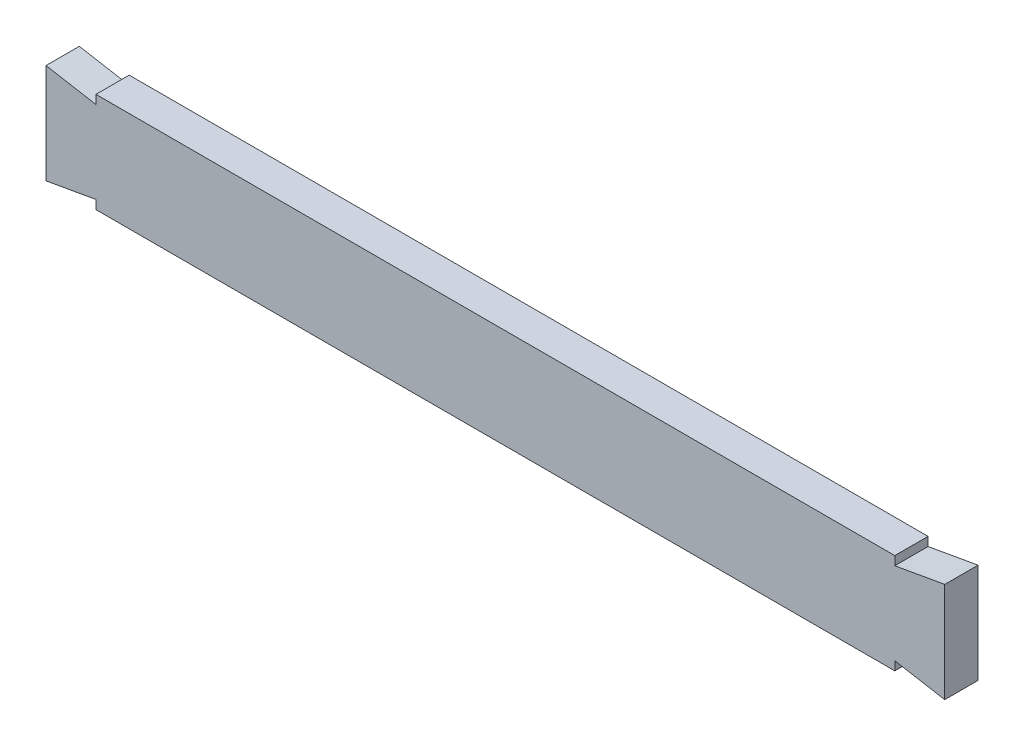
ISO-10303-21;
HEADER;
FILE_DESCRIPTION(('STEP AP214'),'2;1');
FILE_NAME('part.step','',(''),(''),'','','');
FILE_SCHEMA(('AUTOMOTIVE_DESIGN { 1 0 10303 214 1 1 1 1 }'));
ENDSEC;
DATA;
#1=APPLICATION_CONTEXT('core data for automotive mechanical design processes');
#2=APPLICATION_PROTOCOL_DEFINITION('international standard','automotive_design',2000,#1);
#3=PRODUCT_CONTEXT('',#1,'mechanical');
#4=PRODUCT('Part','Part','',(#3));
#5=PRODUCT_RELATED_PRODUCT_CATEGORY('part','',(#4));
#6=PRODUCT_DEFINITION_FORMATION('','',#4);
#7=PRODUCT_DEFINITION_CONTEXT('part definition',#1,'design');
#8=PRODUCT_DEFINITION('design','',#6,#7);
#9=PRODUCT_DEFINITION_SHAPE('','',#8);
#10=(LENGTH_UNIT() NAMED_UNIT(*) SI_UNIT(.MILLI.,.METRE.));
#11=(NAMED_UNIT(*) PLANE_ANGLE_UNIT() SI_UNIT($,.RADIAN.));
#12=(NAMED_UNIT(*) SI_UNIT($,.STERADIAN.) SOLID_ANGLE_UNIT());
#13=UNCERTAINTY_MEASURE_WITH_UNIT(LENGTH_MEASURE(1.E-05),#10,'distance_accuracy_value','');
#14=(GEOMETRIC_REPRESENTATION_CONTEXT(3) GLOBAL_UNCERTAINTY_ASSIGNED_CONTEXT((#13)) GLOBAL_UNIT_ASSIGNED_CONTEXT((#10,
#11,#12)) REPRESENTATION_CONTEXT('',''));
#15=CARTESIAN_POINT('',(0.,0.,0.));
#16=DIRECTION('',(0.,0.,1.));
#17=DIRECTION('',(1.,0.,0.));
#18=AXIS2_PLACEMENT_3D('',#15,#16,#17);
#19=CARTESIAN_POINT('',(0.,0.,10.));
#20=DIRECTION('',(1.,0.,0.));
#21=DIRECTION('',(0.,0.,-1.));
#22=AXIS2_PLACEMENT_3D('',#19,#20,#21);
#23=PLANE('',#22);
#24=DIRECTION('',(0.,-1.,0.));
#25=VECTOR('',#24,1.);
#26=CARTESIAN_POINT('',(0.,0.,0.));
#27=LINE('',#26,#25);
#28=CARTESIAN_POINT('',(0.,30.,0.));
#29=VERTEX_POINT('',#28);
#30=CARTESIAN_POINT('',(0.,0.,0.));
#31=VERTEX_POINT('',#30);
#32=EDGE_CURVE('E134',#29,#31,#27,.T.);
#33=ORIENTED_EDGE('',*,*,#32,.T.);
#34=DIRECTION('',(0.,0.,-1.));
#35=VECTOR('',#34,1.);
#36=CARTESIAN_POINT('',(0.,0.,10.));
#37=LINE('',#36,#35);
#38=CARTESIAN_POINT('',(0.,0.,10.));
#39=VERTEX_POINT('',#38);
#40=EDGE_CURVE('E11',#39,#31,#37,.T.);
#41=ORIENTED_EDGE('',*,*,#40,.F.);
#42=DIRECTION('',(0.,-1.,0.));
#43=VECTOR('',#42,1.);
#44=CARTESIAN_POINT('',(0.,0.,10.));
#45=LINE('',#44,#43);
#46=CARTESIAN_POINT('',(0.,30.,10.));
#47=VERTEX_POINT('',#46);
#48=EDGE_CURVE('E159',#47,#39,#45,.T.);
#49=ORIENTED_EDGE('',*,*,#48,.F.);
#50=DIRECTION('',(0.,0.,-1.));
#51=VECTOR('',#50,1.);
#52=CARTESIAN_POINT('',(0.,30.,10.));
#53=LINE('',#52,#51);
#54=EDGE_CURVE('E140',#47,#29,#53,.T.);
#55=ORIENTED_EDGE('',*,*,#54,.T.);
#56=EDGE_LOOP('',(#33,#41,#49,#55));
#57=FACE_BOUND('',#56,.T.);
#58=ADVANCED_FACE('F32',(#57),#23,.F.);
#59=CARTESIAN_POINT('',(0.,0.,10.));
#60=DIRECTION('',(0.,1.,0.));
#61=DIRECTION('',(0.,0.,1.));
#62=AXIS2_PLACEMENT_3D('',#59,#60,#61);
#63=PLANE('',#62);
#64=DIRECTION('',(1.,0.,0.));
#65=VECTOR('',#64,1.);
#66=CARTESIAN_POINT('',(0.,0.,0.));
#67=LINE('',#66,#65);
#68=CARTESIAN_POINT('',(15.,0.,0.));
#69=VERTEX_POINT('',#68);
#70=CARTESIAN_POINT('',(255.,0.,0.));
#71=VERTEX_POINT('',#70);
#72=EDGE_CURVE('E141',#69,#71,#67,.T.);
#73=ORIENTED_EDGE('',*,*,#72,.T.);
#74=DIRECTION('',(0.,0.,1.));
#75=VECTOR('',#74,1.);
#76=CARTESIAN_POINT('',(255.,0.,0.));
#77=LINE('',#76,#75);
#78=CARTESIAN_POINT('',(255.,0.,10.));
#79=VERTEX_POINT('',#78);
#80=EDGE_CURVE('E223',#71,#79,#77,.T.);
#81=ORIENTED_EDGE('',*,*,#80,.T.);
#82=DIRECTION('',(1.,0.,0.));
#83=VECTOR('',#82,1.);
#84=CARTESIAN_POINT('',(0.,0.,10.));
#85=LINE('',#84,#83);
#86=CARTESIAN_POINT('',(15.,0.,10.));
#87=VERTEX_POINT('',#86);
#88=EDGE_CURVE('E165',#87,#79,#85,.T.);
#89=ORIENTED_EDGE('',*,*,#88,.F.);
#90=DIRECTION('',(0.,0.,1.));
#91=VECTOR('',#90,1.);
#92=CARTESIAN_POINT('',(15.,0.,0.));
#93=LINE('',#92,#91);
#94=EDGE_CURVE('E222',#69,#87,#93,.T.);
#95=ORIENTED_EDGE('',*,*,#94,.F.);
#96=EDGE_LOOP('',(#73,#81,#89,#95));
#97=FACE_BOUND('',#96,.T.);
#98=ADVANCED_FACE('F221',(#97),#63,.F.);
#99=CARTESIAN_POINT('',(270.,0.,10.));
#100=DIRECTION('',(-1.,0.,0.));
#101=DIRECTION('',(0.,0.,1.));
#102=AXIS2_PLACEMENT_3D('',#99,#100,#101);
#103=PLANE('',#102);
#104=DIRECTION('',(0.,1.,0.));
#105=VECTOR('',#104,1.);
#106=CARTESIAN_POINT('',(270.,0.,0.));
#107=LINE('',#106,#105);
#108=CARTESIAN_POINT('',(270.,0.,0.));
#109=VERTEX_POINT('',#108);
#110=CARTESIAN_POINT('',(270.,30.,0.));
#111=VERTEX_POINT('',#110);
#112=EDGE_CURVE('E145',#109,#111,#107,.T.);
#113=ORIENTED_EDGE('',*,*,#112,.T.);
#114=DIRECTION('',(0.,0.,-1.));
#115=VECTOR('',#114,1.);
#116=CARTESIAN_POINT('',(270.,30.,10.));
#117=LINE('',#116,#115);
#118=CARTESIAN_POINT('',(270.,30.,10.));
#119=VERTEX_POINT('',#118);
#120=EDGE_CURVE('E161',#119,#111,#117,.T.);
#121=ORIENTED_EDGE('',*,*,#120,.F.);
#122=DIRECTION('',(0.,1.,0.));
#123=VECTOR('',#122,1.);
#124=CARTESIAN_POINT('',(270.,0.,10.));
#125=LINE('',#124,#123);
#126=CARTESIAN_POINT('',(270.,0.,10.));
#127=VERTEX_POINT('',#126);
#128=EDGE_CURVE('E174',#127,#119,#125,.T.);
#129=ORIENTED_EDGE('',*,*,#128,.F.);
#130=DIRECTION('',(0.,0.,-1.));
#131=VECTOR('',#130,1.);
#132=CARTESIAN_POINT('',(270.,0.,10.));
#133=LINE('',#132,#131);
#134=EDGE_CURVE('E40',#127,#109,#133,.T.);
#135=ORIENTED_EDGE('',*,*,#134,.T.);
#136=EDGE_LOOP('',(#113,#121,#129,#135));
#137=FACE_BOUND('',#136,.T.);
#138=ADVANCED_FACE('F194',(#137),#103,.F.);
#139=CARTESIAN_POINT('',(0.,30.,10.));
#140=DIRECTION('',(0.,-1.,0.));
#141=DIRECTION('',(0.,0.,-1.));
#142=AXIS2_PLACEMENT_3D('',#139,#140,#141);
#143=PLANE('',#142);
#144=DIRECTION('',(-1.,0.,0.));
#145=VECTOR('',#144,1.);
#146=CARTESIAN_POINT('',(0.,30.,10.));
#147=LINE('',#146,#145);
#148=CARTESIAN_POINT('',(255.,30.,10.));
#149=VERTEX_POINT('',#148);
#150=CARTESIAN_POINT('',(15.,30.,10.));
#151=VERTEX_POINT('',#150);
#152=EDGE_CURVE('E151',#149,#151,#147,.T.);
#153=ORIENTED_EDGE('',*,*,#152,.F.);
#154=DIRECTION('',(0.,0.,1.));
#155=VECTOR('',#154,1.);
#156=CARTESIAN_POINT('',(255.,30.,0.));
#157=LINE('',#156,#155);
#158=CARTESIAN_POINT('',(255.,30.,0.));
#159=VERTEX_POINT('',#158);
#160=EDGE_CURVE('E229',#159,#149,#157,.T.);
#161=ORIENTED_EDGE('',*,*,#160,.F.);
#162=DIRECTION('',(-1.,0.,0.));
#163=VECTOR('',#162,1.);
#164=CARTESIAN_POINT('',(0.,30.,0.));
#165=LINE('',#164,#163);
#166=CARTESIAN_POINT('',(15.,30.,0.));
#167=VERTEX_POINT('',#166);
#168=EDGE_CURVE('E156',#159,#167,#165,.T.);
#169=ORIENTED_EDGE('',*,*,#168,.T.);
#170=DIRECTION('',(0.,0.,1.));
#171=VECTOR('',#170,1.);
#172=CARTESIAN_POINT('',(15.,30.,0.));
#173=LINE('',#172,#171);
#174=EDGE_CURVE('E239',#167,#151,#173,.T.);
#175=ORIENTED_EDGE('',*,*,#174,.T.);
#176=EDGE_LOOP('',(#153,#161,#169,#175));
#177=FACE_BOUND('',#176,.T.);
#178=ADVANCED_FACE('F258',(#177),#143,.F.);
#179=CARTESIAN_POINT('',(0.,0.,10.));
#180=DIRECTION('',(0.,0.,-1.));
#181=DIRECTION('',(-1.,0.,0.));
#182=AXIS2_PLACEMENT_3D('',#179,#180,#181);
#183=PLANE('',#182);
#184=DIRECTION('',(-0.984807753012209,-0.173648177666928,0.));
#185=VECTOR('',#184,1.);
#186=CARTESIAN_POINT('',(3.01119404401717,-17.077330037176,10.));
#187=LINE('',#186,#185);
#188=CARTESIAN_POINT('',(255.,27.3550952893731,10.));
#189=VERTEX_POINT('',#188);
#190=EDGE_CURVE('E148',#119,#189,#187,.T.);
#191=ORIENTED_EDGE('',*,*,#190,.T.);
#192=DIRECTION('',(0.,1.,0.));
#193=VECTOR('',#192,1.);
#194=CARTESIAN_POINT('',(255.,0.,10.));
#195=LINE('',#194,#193);
#196=EDGE_CURVE('E142',#189,#149,#195,.T.);
#197=ORIENTED_EDGE('',*,*,#196,.T.);
#198=ORIENTED_EDGE('',*,*,#152,.T.);
#199=DIRECTION('',(0.,-1.,0.));
#200=VECTOR('',#199,1.);
#201=CARTESIAN_POINT('',(15.,0.,10.));
#202=LINE('',#201,#200);
#203=CARTESIAN_POINT('',(15.,27.3550952893731,10.));
#204=VERTEX_POINT('',#203);
#205=EDGE_CURVE('E247',#151,#204,#202,.T.);
#206=ORIENTED_EDGE('',*,*,#205,.T.);
#207=DIRECTION('',(-0.984807753012208,0.173648177666928,0.));
#208=VECTOR('',#207,1.);
#209=CARTESIAN_POINT('',(5.13030214988496,29.0953893117887,10.));
#210=LINE('',#209,#208);
#211=EDGE_CURVE('E242',#204,#47,#210,.T.);
#212=ORIENTED_EDGE('',*,*,#211,.T.);
#213=ORIENTED_EDGE('',*,*,#48,.T.);
#214=DIRECTION('',(0.984807753012209,0.173648177666924,0.));
#215=VECTOR('',#214,1.);
#216=CARTESIAN_POINT('',(0.,0.,10.));
#217=LINE('',#216,#215);
#218=CARTESIAN_POINT('',(15.,2.64490471062687,10.));
#219=VERTEX_POINT('',#218);
#220=EDGE_CURVE('E123',#39,#219,#217,.T.);
#221=ORIENTED_EDGE('',*,*,#220,.T.);
#222=DIRECTION('',(0.,-1.,0.));
#223=VECTOR('',#222,1.);
#224=CARTESIAN_POINT('',(15.,0.,10.));
#225=LINE('',#224,#223);
#226=EDGE_CURVE('E207',#219,#87,#225,.T.);
#227=ORIENTED_EDGE('',*,*,#226,.T.);
#228=ORIENTED_EDGE('',*,*,#88,.T.);
#229=DIRECTION('',(0.,1.,0.));
#230=VECTOR('',#229,1.);
#231=CARTESIAN_POINT('',(255.,0.,10.));
#232=LINE('',#231,#230);
#233=CARTESIAN_POINT('',(255.,2.64490471062687,10.));
#234=VERTEX_POINT('',#233);
#235=EDGE_CURVE('E204',#79,#234,#232,.T.);
#236=ORIENTED_EDGE('',*,*,#235,.T.);
#237=DIRECTION('',(0.984807753012209,-0.173648177666924,0.));
#238=VECTOR('',#237,1.);
#239=CARTESIAN_POINT('',(8.14149619390181,46.1727193489637,10.));
#240=LINE('',#239,#238);
#241=EDGE_CURVE('E198',#234,#127,#240,.T.);
#242=ORIENTED_EDGE('',*,*,#241,.T.);
#243=ORIENTED_EDGE('',*,*,#128,.T.);
#244=EDGE_LOOP('',(#191,#197,#198,#206,#212,#213,#221,#227,#228,#236,#242,#243));
#245=FACE_BOUND('',#244,.T.);
#246=ADVANCED_FACE('F202',(#245),#183,.F.);
#247=CARTESIAN_POINT('',(0.,0.,0.));
#248=DIRECTION('',(0.,0.,-1.));
#249=DIRECTION('',(-1.,0.,0.));
#250=AXIS2_PLACEMENT_3D('',#247,#248,#249);
#251=PLANE('',#250);
#252=DIRECTION('',(0.,-1.,0.));
#253=VECTOR('',#252,1.);
#254=CARTESIAN_POINT('',(255.,27.3550952893731,0.));
#255=LINE('',#254,#253);
#256=CARTESIAN_POINT('',(255.,27.3550952893731,0.));
#257=VERTEX_POINT('',#256);
#258=EDGE_CURVE('E191',#159,#257,#255,.T.);
#259=ORIENTED_EDGE('',*,*,#258,.T.);
#260=DIRECTION('',(0.984807753012209,0.173648177666928,0.));
#261=VECTOR('',#260,1.);
#262=CARTESIAN_POINT('',(270.,30.,0.));
#263=LINE('',#262,#261);
#264=EDGE_CURVE('E184',#257,#111,#263,.T.);
#265=ORIENTED_EDGE('',*,*,#264,.T.);
#266=ORIENTED_EDGE('',*,*,#112,.F.);
#267=DIRECTION('',(-0.984807753012209,0.173648177666924,0.));
#268=VECTOR('',#267,1.);
#269=CARTESIAN_POINT('',(270.,0.,0.));
#270=LINE('',#269,#268);
#271=CARTESIAN_POINT('',(255.,2.64490471062687,0.));
#272=VERTEX_POINT('',#271);
#273=EDGE_CURVE('E199',#109,#272,#270,.T.);
#274=ORIENTED_EDGE('',*,*,#273,.T.);
#275=DIRECTION('',(0.,-1.,0.));
#276=VECTOR('',#275,1.);
#277=CARTESIAN_POINT('',(255.,2.64490471062687,0.));
#278=LINE('',#277,#276);
#279=EDGE_CURVE('E48',#272,#71,#278,.T.);
#280=ORIENTED_EDGE('',*,*,#279,.T.);
#281=ORIENTED_EDGE('',*,*,#72,.F.);
#282=DIRECTION('',(0.,1.,0.));
#283=VECTOR('',#282,1.);
#284=CARTESIAN_POINT('',(15.,2.64490471062687,0.));
#285=LINE('',#284,#283);
#286=CARTESIAN_POINT('',(15.,2.64490471062687,0.));
#287=VERTEX_POINT('',#286);
#288=EDGE_CURVE('E136',#69,#287,#285,.T.);
#289=ORIENTED_EDGE('',*,*,#288,.T.);
#290=DIRECTION('',(-0.984807753012209,-0.173648177666925,0.));
#291=VECTOR('',#290,1.);
#292=CARTESIAN_POINT('',(0.,0.,0.));
#293=LINE('',#292,#291);
#294=EDGE_CURVE('E55',#287,#31,#293,.T.);
#295=ORIENTED_EDGE('',*,*,#294,.T.);
#296=ORIENTED_EDGE('',*,*,#32,.F.);
#297=DIRECTION('',(0.984807753012208,-0.173648177666928,0.));
#298=VECTOR('',#297,1.);
#299=CARTESIAN_POINT('',(0.,30.,0.));
#300=LINE('',#299,#298);
#301=CARTESIAN_POINT('',(15.,27.3550952893731,0.));
#302=VERTEX_POINT('',#301);
#303=EDGE_CURVE('E232',#29,#302,#300,.T.);
#304=ORIENTED_EDGE('',*,*,#303,.T.);
#305=DIRECTION('',(0.,1.,0.));
#306=VECTOR('',#305,1.);
#307=CARTESIAN_POINT('',(15.,27.3550952893731,0.));
#308=LINE('',#307,#306);
#309=EDGE_CURVE('E234',#302,#167,#308,.T.);
#310=ORIENTED_EDGE('',*,*,#309,.T.);
#311=ORIENTED_EDGE('',*,*,#168,.F.);
#312=EDGE_LOOP('',(#259,#265,#266,#274,#280,#281,#289,#295,#296,#304,#310,#311));
#313=FACE_BOUND('',#312,.T.);
#314=ADVANCED_FACE('F132',(#313),#251,.T.);
#315=CARTESIAN_POINT('',(15.,27.3550952893731,0.));
#316=DIRECTION('',(1.,0.,0.));
#317=DIRECTION('',(0.,1.,0.));
#318=AXIS2_PLACEMENT_3D('',#315,#316,#317);
#319=PLANE('',#318);
#320=ORIENTED_EDGE('',*,*,#174,.F.);
#321=ORIENTED_EDGE('',*,*,#309,.F.);
#322=DIRECTION('',(0.,0.,1.));
#323=VECTOR('',#322,1.);
#324=CARTESIAN_POINT('',(15.,27.3550952893731,0.));
#325=LINE('',#324,#323);
#326=EDGE_CURVE('E238',#302,#204,#325,.T.);
#327=ORIENTED_EDGE('',*,*,#326,.T.);
#328=ORIENTED_EDGE('',*,*,#205,.F.);
#329=EDGE_LOOP('',(#320,#321,#327,#328));
#330=FACE_BOUND('',#329,.T.);
#331=ADVANCED_FACE('F255',(#330),#319,.F.);
#332=CARTESIAN_POINT('',(0.,30.,0.));
#333=DIRECTION('',(-0.173648177666928,-0.984807753012208,0.));
#334=DIRECTION('',(0.984807753012208,-0.173648177666928,0.));
#335=AXIS2_PLACEMENT_3D('',#332,#333,#334);
#336=PLANE('',#335);
#337=ORIENTED_EDGE('',*,*,#326,.F.);
#338=ORIENTED_EDGE('',*,*,#303,.F.);
#339=ORIENTED_EDGE('',*,*,#54,.F.);
#340=ORIENTED_EDGE('',*,*,#211,.F.);
#341=EDGE_LOOP('',(#337,#338,#339,#340));
#342=FACE_BOUND('',#341,.T.);
#343=ADVANCED_FACE('F261',(#342),#336,.F.);
#344=CARTESIAN_POINT('',(0.,0.,0.));
#345=DIRECTION('',(-0.173648177666924,0.984807753012209,0.));
#346=DIRECTION('',(-0.984807753012209,-0.173648177666924,0.));
#347=AXIS2_PLACEMENT_3D('',#344,#345,#346);
#348=PLANE('',#347);
#349=ORIENTED_EDGE('',*,*,#40,.T.);
#350=ORIENTED_EDGE('',*,*,#294,.F.);
#351=DIRECTION('',(0.,0.,1.));
#352=VECTOR('',#351,1.);
#353=CARTESIAN_POINT('',(15.,2.64490471062687,0.));
#354=LINE('',#353,#352);
#355=EDGE_CURVE('E235',#287,#219,#354,.T.);
#356=ORIENTED_EDGE('',*,*,#355,.T.);
#357=ORIENTED_EDGE('',*,*,#220,.F.);
#358=EDGE_LOOP('',(#349,#350,#356,#357));
#359=FACE_BOUND('',#358,.T.);
#360=ADVANCED_FACE('F121',(#359),#348,.F.);
#361=CARTESIAN_POINT('',(15.,2.64490471062687,0.));
#362=DIRECTION('',(1.,0.,0.));
#363=DIRECTION('',(0.,1.,0.));
#364=AXIS2_PLACEMENT_3D('',#361,#362,#363);
#365=PLANE('',#364);
#366=ORIENTED_EDGE('',*,*,#355,.F.);
#367=ORIENTED_EDGE('',*,*,#288,.F.);
#368=ORIENTED_EDGE('',*,*,#94,.T.);
#369=ORIENTED_EDGE('',*,*,#226,.F.);
#370=EDGE_LOOP('',(#366,#367,#368,#369));
#371=FACE_BOUND('',#370,.T.);
#372=ADVANCED_FACE('F268',(#371),#365,.F.);
#373=CARTESIAN_POINT('',(255.,2.64490471062687,0.));
#374=DIRECTION('',(-1.,0.,0.));
#375=DIRECTION('',(0.,0.,1.));
#376=AXIS2_PLACEMENT_3D('',#373,#374,#375);
#377=PLANE('',#376);
#378=ORIENTED_EDGE('',*,*,#80,.F.);
#379=ORIENTED_EDGE('',*,*,#279,.F.);
#380=DIRECTION('',(0.,0.,1.));
#381=VECTOR('',#380,1.);
#382=CARTESIAN_POINT('',(255.,2.64490471062687,0.));
#383=LINE('',#382,#381);
#384=EDGE_CURVE('E137',#272,#234,#383,.T.);
#385=ORIENTED_EDGE('',*,*,#384,.T.);
#386=ORIENTED_EDGE('',*,*,#235,.F.);
#387=EDGE_LOOP('',(#378,#379,#385,#386));
#388=FACE_BOUND('',#387,.T.);
#389=ADVANCED_FACE('F316',(#388),#377,.F.);
#390=CARTESIAN_POINT('',(270.,0.,0.));
#391=DIRECTION('',(0.173648177666924,0.984807753012209,0.));
#392=DIRECTION('',(-0.984807753012209,0.173648177666924,0.));
#393=AXIS2_PLACEMENT_3D('',#390,#391,#392);
#394=PLANE('',#393);
#395=ORIENTED_EDGE('',*,*,#384,.F.);
#396=ORIENTED_EDGE('',*,*,#273,.F.);
#397=ORIENTED_EDGE('',*,*,#134,.F.);
#398=ORIENTED_EDGE('',*,*,#241,.F.);
#399=EDGE_LOOP('',(#395,#396,#397,#398));
#400=FACE_BOUND('',#399,.T.);
#401=ADVANCED_FACE('F197',(#400),#394,.F.);
#402=CARTESIAN_POINT('',(255.,27.3550952893731,0.));
#403=DIRECTION('',(-1.,0.,0.));
#404=DIRECTION('',(0.,0.,1.));
#405=AXIS2_PLACEMENT_3D('',#402,#403,#404);
#406=PLANE('',#405);
#407=DIRECTION('',(0.,0.,1.));
#408=VECTOR('',#407,1.);
#409=CARTESIAN_POINT('',(255.,27.3550952893731,0.));
#410=LINE('',#409,#408);
#411=EDGE_CURVE('E192',#257,#189,#410,.T.);
#412=ORIENTED_EDGE('',*,*,#411,.F.);
#413=ORIENTED_EDGE('',*,*,#258,.F.);
#414=ORIENTED_EDGE('',*,*,#160,.T.);
#415=ORIENTED_EDGE('',*,*,#196,.F.);
#416=EDGE_LOOP('',(#412,#413,#414,#415));
#417=FACE_BOUND('',#416,.T.);
#418=ADVANCED_FACE('F334',(#417),#406,.F.);
#419=CARTESIAN_POINT('',(270.,30.,0.));
#420=DIRECTION('',(0.173648177666928,-0.984807753012209,0.));
#421=DIRECTION('',(0.984807753012209,0.173648177666928,0.));
#422=AXIS2_PLACEMENT_3D('',#419,#420,#421);
#423=PLANE('',#422);
#424=ORIENTED_EDGE('',*,*,#120,.T.);
#425=ORIENTED_EDGE('',*,*,#264,.F.);
#426=ORIENTED_EDGE('',*,*,#411,.T.);
#427=ORIENTED_EDGE('',*,*,#190,.F.);
#428=EDGE_LOOP('',(#424,#425,#426,#427));
#429=FACE_BOUND('',#428,.T.);
#430=ADVANCED_FACE('F182',(#429),#423,.F.);
#431=CLOSED_SHELL('',(#58,#98,#138,#178,#246,#314,#331,#343,#360,#372,#389,#401,#418,#430));
#432=MANIFOLD_SOLID_BREP('B2',#431);
#433=ADVANCED_BREP_SHAPE_REPRESENTATION('',(#18,#432),#14);
#434=SHAPE_DEFINITION_REPRESENTATION(#9,#433);
ENDSEC;
END-ISO-10303-21;
